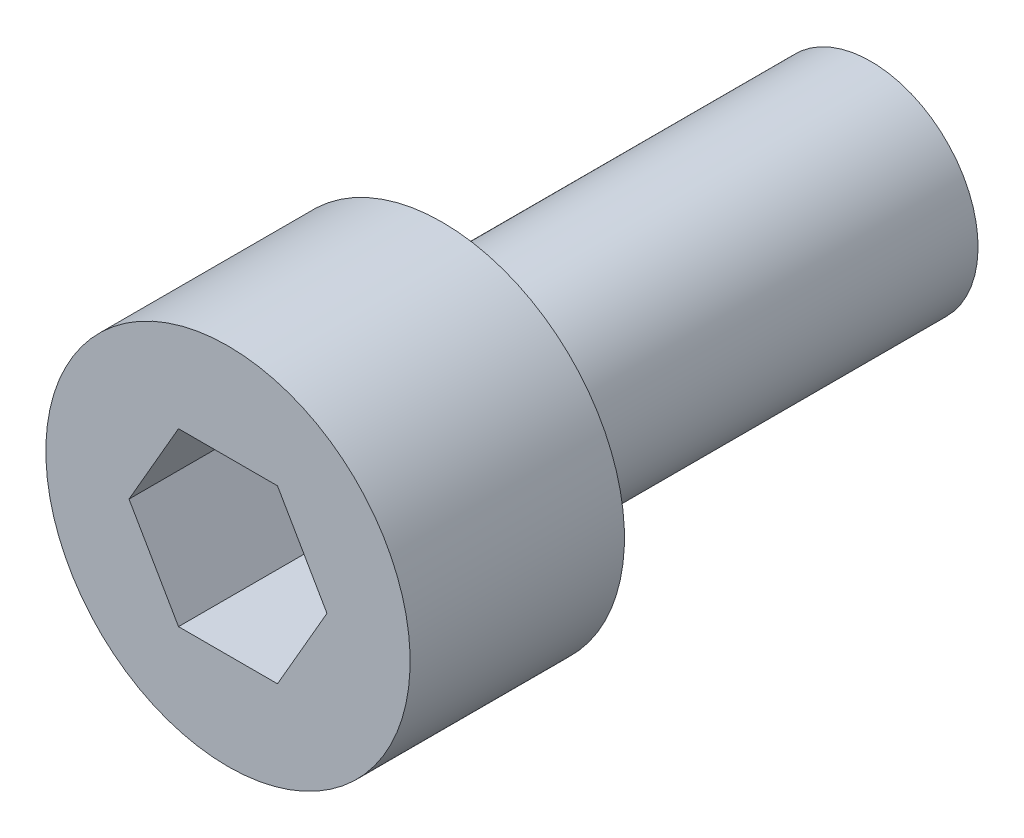
ISO-10303-21;
HEADER;
FILE_DESCRIPTION(('STEP AP214'),'2;1');
FILE_NAME('part.step','',(''),(''),'','','');
FILE_SCHEMA(('AUTOMOTIVE_DESIGN { 1 0 10303 214 1 1 1 1 }'));
ENDSEC;
DATA;
#1=APPLICATION_CONTEXT('core data for automotive mechanical design processes');
#2=APPLICATION_PROTOCOL_DEFINITION('international standard','automotive_design',2000,#1);
#3=PRODUCT_CONTEXT('',#1,'mechanical');
#4=PRODUCT('Part','Part','',(#3));
#5=PRODUCT_RELATED_PRODUCT_CATEGORY('part','',(#4));
#6=PRODUCT_DEFINITION_FORMATION('','',#4);
#7=PRODUCT_DEFINITION_CONTEXT('part definition',#1,'design');
#8=PRODUCT_DEFINITION('design','',#6,#7);
#9=PRODUCT_DEFINITION_SHAPE('','',#8);
#10=(LENGTH_UNIT() NAMED_UNIT(*) SI_UNIT(.MILLI.,.METRE.));
#11=(NAMED_UNIT(*) PLANE_ANGLE_UNIT() SI_UNIT($,.RADIAN.));
#12=(NAMED_UNIT(*) SI_UNIT($,.STERADIAN.) SOLID_ANGLE_UNIT());
#13=UNCERTAINTY_MEASURE_WITH_UNIT(LENGTH_MEASURE(1.E-05),#10,'distance_accuracy_value','');
#14=(GEOMETRIC_REPRESENTATION_CONTEXT(3) GLOBAL_UNCERTAINTY_ASSIGNED_CONTEXT((#13)) GLOBAL_UNIT_ASSIGNED_CONTEXT((#10,
#11,#12)) REPRESENTATION_CONTEXT('',''));
#15=CARTESIAN_POINT('',(0.,0.,0.));
#16=DIRECTION('',(0.,0.,1.));
#17=DIRECTION('',(1.,0.,0.));
#18=AXIS2_PLACEMENT_3D('',#15,#16,#17);
#19=CARTESIAN_POINT('',(0.,0.,5.));
#20=DIRECTION('',(0.,0.,-1.));
#21=DIRECTION('',(0.,1.,0.));
#22=AXIS2_PLACEMENT_3D('',#19,#20,#21);
#23=PLANE('',#22);
#24=DIRECTION('',(0.5,0.866025403784439,0.));
#25=VECTOR('',#24,1.);
#26=CARTESIAN_POINT('',(1.15470053837925,-2.,5.));
#27=LINE('',#26,#25);
#28=CARTESIAN_POINT('',(1.15470053837925,-2.,5.));
#29=VERTEX_POINT('',#28);
#30=CARTESIAN_POINT('',(2.3094010767585,0.,5.));
#31=VERTEX_POINT('',#30);
#32=EDGE_CURVE('E124',#29,#31,#27,.T.);
#33=ORIENTED_EDGE('',*,*,#32,.F.);
#34=DIRECTION('',(1.,0.,0.));
#35=VECTOR('',#34,1.);
#36=CARTESIAN_POINT('',(-1.15470053837925,-2.,5.));
#37=LINE('',#36,#35);
#38=CARTESIAN_POINT('',(-1.15470053837925,-2.,5.));
#39=VERTEX_POINT('',#38);
#40=EDGE_CURVE('E50',#39,#29,#37,.T.);
#41=ORIENTED_EDGE('',*,*,#40,.F.);
#42=DIRECTION('',(0.5,-0.866025403784439,0.));
#43=VECTOR('',#42,1.);
#44=CARTESIAN_POINT('',(-2.3094010767585,0.,5.));
#45=LINE('',#44,#43);
#46=CARTESIAN_POINT('',(-2.3094010767585,0.,5.));
#47=VERTEX_POINT('',#46);
#48=EDGE_CURVE('E133',#47,#39,#45,.T.);
#49=ORIENTED_EDGE('',*,*,#48,.F.);
#50=DIRECTION('',(-0.5,-0.866025403784439,0.));
#51=VECTOR('',#50,1.);
#52=CARTESIAN_POINT('',(-1.15470053837925,2.,5.));
#53=LINE('',#52,#51);
#54=CARTESIAN_POINT('',(-1.15470053837925,2.,5.));
#55=VERTEX_POINT('',#54);
#56=EDGE_CURVE('E131',#55,#47,#53,.T.);
#57=ORIENTED_EDGE('',*,*,#56,.F.);
#58=DIRECTION('',(-1.,0.,0.));
#59=VECTOR('',#58,1.);
#60=CARTESIAN_POINT('',(1.15470053837925,2.,5.));
#61=LINE('',#60,#59);
#62=CARTESIAN_POINT('',(1.15470053837925,2.,5.));
#63=VERTEX_POINT('',#62);
#64=EDGE_CURVE('E98',#63,#55,#61,.T.);
#65=ORIENTED_EDGE('',*,*,#64,.F.);
#66=DIRECTION('',(-0.5,0.866025403784439,0.));
#67=VECTOR('',#66,1.);
#68=CARTESIAN_POINT('',(2.3094010767585,0.,5.));
#69=LINE('',#68,#67);
#70=EDGE_CURVE('E127',#31,#63,#69,.T.);
#71=ORIENTED_EDGE('',*,*,#70,.F.);
#72=EDGE_LOOP('',(#33,#41,#49,#57,#65,#71));
#73=FACE_BOUND('',#72,.T.);
#74=CARTESIAN_POINT('',(0.,0.,5.));
#75=DIRECTION('',(0.,0.,1.));
#76=DIRECTION('',(0.,-1.,0.));
#77=AXIS2_PLACEMENT_3D('',#74,#75,#76);
#78=CIRCLE('',#77,4.25);
#79=CARTESIAN_POINT('',(0.,-4.25,5.));
#80=VERTEX_POINT('',#79);
#81=EDGE_CURVE('E11',#80,#80,#78,.T.);
#82=ORIENTED_EDGE('',*,*,#81,.T.);
#83=EDGE_LOOP('',(#82));
#84=FACE_BOUND('',#83,.T.);
#85=ADVANCED_FACE('F36',(#73,#84),#23,.F.);
#86=CARTESIAN_POINT('',(0.,0.,5.58488227818494));
#87=DIRECTION('',(0.,0.,1.));
#88=DIRECTION('',(0.,-1.,0.));
#89=AXIS2_PLACEMENT_3D('',#86,#87,#88);
#90=CYLINDRICAL_SURFACE('',#89,4.25);
#91=ORIENTED_EDGE('',*,*,#81,.F.);
#92=EDGE_LOOP('',(#91));
#93=FACE_BOUND('',#92,.T.);
#94=CARTESIAN_POINT('',(0.,0.,0.));
#95=DIRECTION('',(0.,0.,1.));
#96=DIRECTION('',(0.,-1.,0.));
#97=AXIS2_PLACEMENT_3D('',#94,#95,#96);
#98=CIRCLE('',#97,4.25);
#99=CARTESIAN_POINT('',(0.,-4.25,0.));
#100=VERTEX_POINT('',#99);
#101=EDGE_CURVE('E43',#100,#100,#98,.T.);
#102=ORIENTED_EDGE('',*,*,#101,.T.);
#103=EDGE_LOOP('',(#102));
#104=FACE_BOUND('',#103,.T.);
#105=ADVANCED_FACE('F150',(#93,#104),#90,.T.);
#106=CARTESIAN_POINT('',(0.,4.25,0.));
#107=DIRECTION('',(0.,0.,1.));
#108=DIRECTION('',(0.,-1.,0.));
#109=AXIS2_PLACEMENT_3D('',#106,#107,#108);
#110=PLANE('',#109);
#111=ORIENTED_EDGE('',*,*,#101,.F.);
#112=EDGE_LOOP('',(#111));
#113=FACE_BOUND('',#112,.T.);
#114=CARTESIAN_POINT('',(0.,0.,0.));
#115=DIRECTION('',(0.,0.,1.));
#116=DIRECTION('',(0.,-1.,0.));
#117=AXIS2_PLACEMENT_3D('',#114,#115,#116);
#118=CIRCLE('',#117,2.5);
#119=CARTESIAN_POINT('',(0.,-2.5,0.));
#120=VERTEX_POINT('',#119);
#121=EDGE_CURVE('E145',#120,#120,#118,.T.);
#122=ORIENTED_EDGE('',*,*,#121,.T.);
#123=EDGE_LOOP('',(#122));
#124=FACE_BOUND('',#123,.T.);
#125=ADVANCED_FACE('F152',(#113,#124),#110,.F.);
#126=CARTESIAN_POINT('',(0.,0.,5.58488227818494));
#127=DIRECTION('',(0.,0.,1.));
#128=DIRECTION('',(0.,-1.,0.));
#129=AXIS2_PLACEMENT_3D('',#126,#127,#128);
#130=CYLINDRICAL_SURFACE('',#129,2.5);
#131=ORIENTED_EDGE('',*,*,#121,.F.);
#132=EDGE_LOOP('',(#131));
#133=FACE_BOUND('',#132,.T.);
#134=CARTESIAN_POINT('',(0.,0.,-10.));
#135=DIRECTION('',(0.,0.,1.));
#136=DIRECTION('',(0.,-1.,0.));
#137=AXIS2_PLACEMENT_3D('',#134,#135,#136);
#138=CIRCLE('',#137,2.5);
#139=CARTESIAN_POINT('',(0.,-2.5,-10.));
#140=VERTEX_POINT('',#139);
#141=EDGE_CURVE('E137',#140,#140,#138,.T.);
#142=ORIENTED_EDGE('',*,*,#141,.T.);
#143=EDGE_LOOP('',(#142));
#144=FACE_BOUND('',#143,.T.);
#145=ADVANCED_FACE('F155',(#133,#144),#130,.T.);
#146=CARTESIAN_POINT('',(0.,2.5,-10.));
#147=DIRECTION('',(0.,0.,1.));
#148=DIRECTION('',(0.,-1.,0.));
#149=AXIS2_PLACEMENT_3D('',#146,#147,#148);
#150=PLANE('',#149);
#151=ORIENTED_EDGE('',*,*,#141,.F.);
#152=EDGE_LOOP('',(#151));
#153=FACE_BOUND('',#152,.T.);
#154=ADVANCED_FACE('F161',(#153),#150,.F.);
#155=CARTESIAN_POINT('',(-1.15470053837925,-2.,2.));
#156=DIRECTION('',(0.,-1.,0.));
#157=DIRECTION('',(1.,0.,0.));
#158=AXIS2_PLACEMENT_3D('',#155,#156,#157);
#159=PLANE('',#158);
#160=ORIENTED_EDGE('',*,*,#40,.T.);
#161=DIRECTION('',(0.,0.,1.));
#162=VECTOR('',#161,1.);
#163=CARTESIAN_POINT('',(1.15470053837925,-2.,2.));
#164=LINE('',#163,#162);
#165=CARTESIAN_POINT('',(1.15470053837925,-2.,2.));
#166=VERTEX_POINT('',#165);
#167=EDGE_CURVE('E80',#166,#29,#164,.T.);
#168=ORIENTED_EDGE('',*,*,#167,.F.);
#169=DIRECTION('',(1.,0.,0.));
#170=VECTOR('',#169,1.);
#171=CARTESIAN_POINT('',(-1.15470053837925,-2.,2.));
#172=LINE('',#171,#170);
#173=CARTESIAN_POINT('',(-1.15470053837925,-2.,2.));
#174=VERTEX_POINT('',#173);
#175=EDGE_CURVE('E135',#174,#166,#172,.T.);
#176=ORIENTED_EDGE('',*,*,#175,.F.);
#177=DIRECTION('',(0.,0.,1.));
#178=VECTOR('',#177,1.);
#179=CARTESIAN_POINT('',(-1.15470053837925,-2.,2.));
#180=LINE('',#179,#178);
#181=EDGE_CURVE('E58',#174,#39,#180,.T.);
#182=ORIENTED_EDGE('',*,*,#181,.T.);
#183=EDGE_LOOP('',(#160,#168,#176,#182));
#184=FACE_BOUND('',#183,.T.);
#185=ADVANCED_FACE('F166',(#184),#159,.F.);
#186=CARTESIAN_POINT('',(-2.3094010767585,0.,2.));
#187=DIRECTION('',(-0.866025403784439,-0.5,0.));
#188=DIRECTION('',(0.5,-0.866025403784439,0.));
#189=AXIS2_PLACEMENT_3D('',#186,#187,#188);
#190=PLANE('',#189);
#191=ORIENTED_EDGE('',*,*,#48,.T.);
#192=ORIENTED_EDGE('',*,*,#181,.F.);
#193=DIRECTION('',(0.5,-0.866025403784439,0.));
#194=VECTOR('',#193,1.);
#195=CARTESIAN_POINT('',(-2.3094010767585,0.,2.));
#196=LINE('',#195,#194);
#197=CARTESIAN_POINT('',(-2.3094010767585,0.,2.));
#198=VERTEX_POINT('',#197);
#199=EDGE_CURVE('E110',#198,#174,#196,.T.);
#200=ORIENTED_EDGE('',*,*,#199,.F.);
#201=DIRECTION('',(0.,0.,1.));
#202=VECTOR('',#201,1.);
#203=CARTESIAN_POINT('',(-2.3094010767585,0.,2.));
#204=LINE('',#203,#202);
#205=EDGE_CURVE('E102',#198,#47,#204,.T.);
#206=ORIENTED_EDGE('',*,*,#205,.T.);
#207=EDGE_LOOP('',(#191,#192,#200,#206));
#208=FACE_BOUND('',#207,.T.);
#209=ADVANCED_FACE('F171',(#208),#190,.F.);
#210=CARTESIAN_POINT('',(-1.15470053837925,2.,2.));
#211=DIRECTION('',(-0.866025403784439,0.5,0.));
#212=DIRECTION('',(-0.5,-0.866025403784439,0.));
#213=AXIS2_PLACEMENT_3D('',#210,#211,#212);
#214=PLANE('',#213);
#215=ORIENTED_EDGE('',*,*,#56,.T.);
#216=ORIENTED_EDGE('',*,*,#205,.F.);
#217=DIRECTION('',(-0.5,-0.866025403784439,0.));
#218=VECTOR('',#217,1.);
#219=CARTESIAN_POINT('',(-1.15470053837925,2.,2.));
#220=LINE('',#219,#218);
#221=CARTESIAN_POINT('',(-1.15470053837925,2.,2.));
#222=VERTEX_POINT('',#221);
#223=EDGE_CURVE('E106',#222,#198,#220,.T.);
#224=ORIENTED_EDGE('',*,*,#223,.F.);
#225=DIRECTION('',(0.,0.,1.));
#226=VECTOR('',#225,1.);
#227=CARTESIAN_POINT('',(-1.15470053837925,2.,2.));
#228=LINE('',#227,#226);
#229=EDGE_CURVE('E91',#222,#55,#228,.T.);
#230=ORIENTED_EDGE('',*,*,#229,.T.);
#231=EDGE_LOOP('',(#215,#216,#224,#230));
#232=FACE_BOUND('',#231,.T.);
#233=ADVANCED_FACE('F107',(#232),#214,.F.);
#234=CARTESIAN_POINT('',(1.15470053837925,2.,2.));
#235=DIRECTION('',(0.,1.,0.));
#236=DIRECTION('',(0.,0.,1.));
#237=AXIS2_PLACEMENT_3D('',#234,#235,#236);
#238=PLANE('',#237);
#239=ORIENTED_EDGE('',*,*,#64,.T.);
#240=ORIENTED_EDGE('',*,*,#229,.F.);
#241=DIRECTION('',(-1.,0.,0.));
#242=VECTOR('',#241,1.);
#243=CARTESIAN_POINT('',(1.15470053837925,2.,2.));
#244=LINE('',#243,#242);
#245=CARTESIAN_POINT('',(1.15470053837925,2.,2.));
#246=VERTEX_POINT('',#245);
#247=EDGE_CURVE('E95',#246,#222,#244,.T.);
#248=ORIENTED_EDGE('',*,*,#247,.F.);
#249=DIRECTION('',(0.,0.,1.));
#250=VECTOR('',#249,1.);
#251=CARTESIAN_POINT('',(1.15470053837925,2.,2.));
#252=LINE('',#251,#250);
#253=EDGE_CURVE('E103',#246,#63,#252,.T.);
#254=ORIENTED_EDGE('',*,*,#253,.T.);
#255=EDGE_LOOP('',(#239,#240,#248,#254));
#256=FACE_BOUND('',#255,.T.);
#257=ADVANCED_FACE('F93',(#256),#238,.F.);
#258=CARTESIAN_POINT('',(2.3094010767585,0.,2.));
#259=DIRECTION('',(0.866025403784439,0.5,0.));
#260=DIRECTION('',(-0.5,0.866025403784439,0.));
#261=AXIS2_PLACEMENT_3D('',#258,#259,#260);
#262=PLANE('',#261);
#263=ORIENTED_EDGE('',*,*,#70,.T.);
#264=ORIENTED_EDGE('',*,*,#253,.F.);
#265=DIRECTION('',(-0.5,0.866025403784439,0.));
#266=VECTOR('',#265,1.);
#267=CARTESIAN_POINT('',(2.3094010767585,0.,2.));
#268=LINE('',#267,#266);
#269=CARTESIAN_POINT('',(2.3094010767585,0.,2.));
#270=VERTEX_POINT('',#269);
#271=EDGE_CURVE('E116',#270,#246,#268,.T.);
#272=ORIENTED_EDGE('',*,*,#271,.F.);
#273=DIRECTION('',(0.,0.,1.));
#274=VECTOR('',#273,1.);
#275=CARTESIAN_POINT('',(2.3094010767585,0.,2.));
#276=LINE('',#275,#274);
#277=EDGE_CURVE('E140',#270,#31,#276,.T.);
#278=ORIENTED_EDGE('',*,*,#277,.T.);
#279=EDGE_LOOP('',(#263,#264,#272,#278));
#280=FACE_BOUND('',#279,.T.);
#281=ADVANCED_FACE('F197',(#280),#262,.F.);
#282=CARTESIAN_POINT('',(1.15470053837925,-2.,2.));
#283=DIRECTION('',(0.866025403784439,-0.5,0.));
#284=DIRECTION('',(0.5,0.866025403784439,0.));
#285=AXIS2_PLACEMENT_3D('',#282,#283,#284);
#286=PLANE('',#285);
#287=ORIENTED_EDGE('',*,*,#32,.T.);
#288=ORIENTED_EDGE('',*,*,#277,.F.);
#289=DIRECTION('',(0.5,0.866025403784439,0.));
#290=VECTOR('',#289,1.);
#291=CARTESIAN_POINT('',(1.15470053837925,-2.,2.));
#292=LINE('',#291,#290);
#293=EDGE_CURVE('E118',#166,#270,#292,.T.);
#294=ORIENTED_EDGE('',*,*,#293,.F.);
#295=ORIENTED_EDGE('',*,*,#167,.T.);
#296=EDGE_LOOP('',(#287,#288,#294,#295));
#297=FACE_BOUND('',#296,.T.);
#298=ADVANCED_FACE('F185',(#297),#286,.F.);
#299=CARTESIAN_POINT('',(-1.15470053837925,-2.,2.));
#300=DIRECTION('',(0.,0.,-1.));
#301=DIRECTION('',(-1.,0.,0.));
#302=AXIS2_PLACEMENT_3D('',#299,#300,#301);
#303=PLANE('',#302);
#304=ORIENTED_EDGE('',*,*,#175,.T.);
#305=ORIENTED_EDGE('',*,*,#293,.T.);
#306=ORIENTED_EDGE('',*,*,#271,.T.);
#307=ORIENTED_EDGE('',*,*,#247,.T.);
#308=ORIENTED_EDGE('',*,*,#223,.T.);
#309=ORIENTED_EDGE('',*,*,#199,.T.);
#310=EDGE_LOOP('',(#304,#305,#306,#307,#308,#309));
#311=FACE_BOUND('',#310,.T.);
#312=ADVANCED_FACE('F113',(#311),#303,.F.);
#313=CLOSED_SHELL('',(#85,#105,#125,#145,#154,#185,#209,#233,#257,#281,#298,#312));
#314=MANIFOLD_SOLID_BREP('B2',#313);
#315=ADVANCED_BREP_SHAPE_REPRESENTATION('',(#18,#314),#14);
#316=SHAPE_DEFINITION_REPRESENTATION(#9,#315);
ENDSEC;
END-ISO-10303-21;
